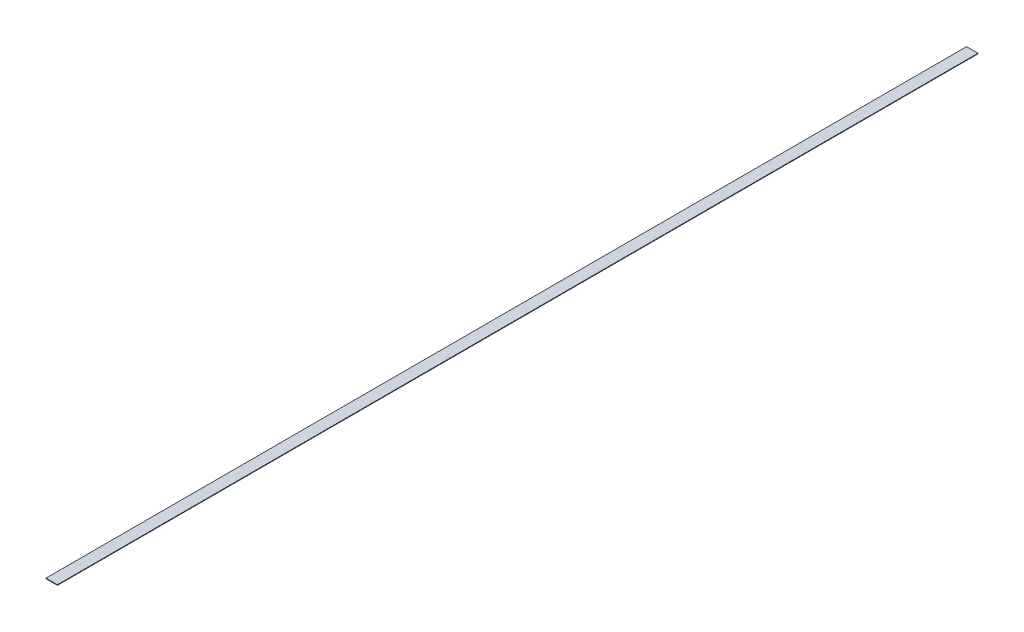
ISO-10303-21;
HEADER;
FILE_DESCRIPTION(('STEP AP214'),'2;1');
FILE_NAME('part.step','',(''),(''),'','','');
FILE_SCHEMA(('AUTOMOTIVE_DESIGN { 1 0 10303 214 1 1 1 1 }'));
ENDSEC;
DATA;
#1=APPLICATION_CONTEXT('core data for automotive mechanical design processes');
#2=APPLICATION_PROTOCOL_DEFINITION('international standard','automotive_design',2000,#1);
#3=PRODUCT_CONTEXT('',#1,'mechanical');
#4=PRODUCT('Part','Part','',(#3));
#5=PRODUCT_RELATED_PRODUCT_CATEGORY('part','',(#4));
#6=PRODUCT_DEFINITION_FORMATION('','',#4);
#7=PRODUCT_DEFINITION_CONTEXT('part definition',#1,'design');
#8=PRODUCT_DEFINITION('design','',#6,#7);
#9=PRODUCT_DEFINITION_SHAPE('','',#8);
#10=(LENGTH_UNIT() NAMED_UNIT(*) SI_UNIT(.MILLI.,.METRE.));
#11=(NAMED_UNIT(*) PLANE_ANGLE_UNIT() SI_UNIT($,.RADIAN.));
#12=(NAMED_UNIT(*) SI_UNIT($,.STERADIAN.) SOLID_ANGLE_UNIT());
#13=UNCERTAINTY_MEASURE_WITH_UNIT(LENGTH_MEASURE(1.E-05),#10,'distance_accuracy_value','');
#14=(GEOMETRIC_REPRESENTATION_CONTEXT(3) GLOBAL_UNCERTAINTY_ASSIGNED_CONTEXT((#13)) GLOBAL_UNIT_ASSIGNED_CONTEXT((#10,
#11,#12)) REPRESENTATION_CONTEXT('',''));
#15=CARTESIAN_POINT('',(0.,0.,0.));
#16=DIRECTION('',(0.,0.,1.));
#17=DIRECTION('',(1.,0.,0.));
#18=AXIS2_PLACEMENT_3D('',#15,#16,#17);
#19=CARTESIAN_POINT('',(-8.75059116986781,1.,-807.162831452454));
#20=DIRECTION('',(0.,0.,1.));
#21=DIRECTION('',(1.,0.,0.));
#22=AXIS2_PLACEMENT_3D('',#19,#20,#21);
#23=PLANE('',#22);
#24=DIRECTION('',(-1.,0.,0.));
#25=VECTOR('',#24,1.);
#26=CARTESIAN_POINT('',(-8.75059116986781,0.,-807.162831452454));
#27=LINE('',#26,#25);
#28=CARTESIAN_POINT('',(11.2494088301322,0.,-807.162831452454));
#29=VERTEX_POINT('',#28);
#30=CARTESIAN_POINT('',(-8.75059116986781,0.,-807.162831452454));
#31=VERTEX_POINT('',#30);
#32=EDGE_CURVE('E97',#29,#31,#27,.T.);
#33=ORIENTED_EDGE('',*,*,#32,.T.);
#34=DIRECTION('',(0.,-1.,0.));
#35=VECTOR('',#34,1.);
#36=CARTESIAN_POINT('',(-8.75059116986781,1.,-807.162831452454));
#37=LINE('',#36,#35);
#38=CARTESIAN_POINT('',(-8.75059116986781,1.,-807.162831452454));
#39=VERTEX_POINT('',#38);
#40=EDGE_CURVE('E11',#39,#31,#37,.T.);
#41=ORIENTED_EDGE('',*,*,#40,.F.);
#42=DIRECTION('',(-1.,0.,0.));
#43=VECTOR('',#42,1.);
#44=CARTESIAN_POINT('',(-8.75059116986781,1.,-807.162831452454));
#45=LINE('',#44,#43);
#46=CARTESIAN_POINT('',(11.2494088301322,1.,-807.162831452454));
#47=VERTEX_POINT('',#46);
#48=EDGE_CURVE('E85',#47,#39,#45,.T.);
#49=ORIENTED_EDGE('',*,*,#48,.F.);
#50=DIRECTION('',(0.,-1.,0.));
#51=VECTOR('',#50,1.);
#52=CARTESIAN_POINT('',(11.2494088301322,1.,-807.162831452454));
#53=LINE('',#52,#51);
#54=EDGE_CURVE('E93',#47,#29,#53,.T.);
#55=ORIENTED_EDGE('',*,*,#54,.T.);
#56=EDGE_LOOP('',(#33,#41,#49,#55));
#57=FACE_BOUND('',#56,.T.);
#58=ADVANCED_FACE('F34',(#57),#23,.F.);
#59=CARTESIAN_POINT('',(-8.75059116986781,1.,-807.162831452454));
#60=DIRECTION('',(1.,0.,0.));
#61=DIRECTION('',(0.,0.,-1.));
#62=AXIS2_PLACEMENT_3D('',#59,#60,#61);
#63=PLANE('',#62);
#64=DIRECTION('',(0.,0.,1.));
#65=VECTOR('',#64,1.);
#66=CARTESIAN_POINT('',(-8.75059116986781,0.,-807.162831452454));
#67=LINE('',#66,#65);
#68=CARTESIAN_POINT('',(-8.75059116986781,0.,805.288718207256));
#69=VERTEX_POINT('',#68);
#70=EDGE_CURVE('E89',#31,#69,#67,.T.);
#71=ORIENTED_EDGE('',*,*,#70,.T.);
#72=DIRECTION('',(0.,-1.,0.));
#73=VECTOR('',#72,1.);
#74=CARTESIAN_POINT('',(-8.75059116986781,1.,805.288718207256));
#75=LINE('',#74,#73);
#76=CARTESIAN_POINT('',(-8.75059116986781,1.,805.288718207256));
#77=VERTEX_POINT('',#76);
#78=EDGE_CURVE('E42',#77,#69,#75,.T.);
#79=ORIENTED_EDGE('',*,*,#78,.F.);
#80=DIRECTION('',(0.,0.,1.));
#81=VECTOR('',#80,1.);
#82=CARTESIAN_POINT('',(-8.75059116986781,1.,-807.162831452454));
#83=LINE('',#82,#81);
#84=EDGE_CURVE('E80',#39,#77,#83,.T.);
#85=ORIENTED_EDGE('',*,*,#84,.F.);
#86=ORIENTED_EDGE('',*,*,#40,.T.);
#87=EDGE_LOOP('',(#71,#79,#85,#86));
#88=FACE_BOUND('',#87,.T.);
#89=ADVANCED_FACE('F88',(#88),#63,.F.);
#90=CARTESIAN_POINT('',(-8.75059116986781,1.,805.288718207256));
#91=DIRECTION('',(0.,0.,-1.));
#92=DIRECTION('',(-1.,0.,0.));
#93=AXIS2_PLACEMENT_3D('',#90,#91,#92);
#94=PLANE('',#93);
#95=DIRECTION('',(1.,0.,0.));
#96=VECTOR('',#95,1.);
#97=CARTESIAN_POINT('',(-8.75059116986781,0.,805.288718207256));
#98=LINE('',#97,#96);
#99=CARTESIAN_POINT('',(11.2494088301322,0.,805.288718207256));
#100=VERTEX_POINT('',#99);
#101=EDGE_CURVE('E67',#69,#100,#98,.T.);
#102=ORIENTED_EDGE('',*,*,#101,.T.);
#103=DIRECTION('',(0.,-1.,0.));
#104=VECTOR('',#103,1.);
#105=CARTESIAN_POINT('',(11.2494088301322,1.,805.288718207256));
#106=LINE('',#105,#104);
#107=CARTESIAN_POINT('',(11.2494088301322,1.,805.288718207256));
#108=VERTEX_POINT('',#107);
#109=EDGE_CURVE('E90',#108,#100,#106,.T.);
#110=ORIENTED_EDGE('',*,*,#109,.F.);
#111=DIRECTION('',(1.,0.,0.));
#112=VECTOR('',#111,1.);
#113=CARTESIAN_POINT('',(-8.75059116986781,1.,805.288718207256));
#114=LINE('',#113,#112);
#115=EDGE_CURVE('E83',#77,#108,#114,.T.);
#116=ORIENTED_EDGE('',*,*,#115,.F.);
#117=ORIENTED_EDGE('',*,*,#78,.T.);
#118=EDGE_LOOP('',(#102,#110,#116,#117));
#119=FACE_BOUND('',#118,.T.);
#120=ADVANCED_FACE('F91',(#119),#94,.F.);
#121=CARTESIAN_POINT('',(11.2494088301322,1.,-807.162831452454));
#122=DIRECTION('',(-1.,0.,0.));
#123=DIRECTION('',(0.,0.,1.));
#124=AXIS2_PLACEMENT_3D('',#121,#122,#123);
#125=PLANE('',#124);
#126=DIRECTION('',(0.,0.,-1.));
#127=VECTOR('',#126,1.);
#128=CARTESIAN_POINT('',(11.2494088301322,0.,-807.162831452454));
#129=LINE('',#128,#127);
#130=EDGE_CURVE('E73',#100,#29,#129,.T.);
#131=ORIENTED_EDGE('',*,*,#130,.T.);
#132=ORIENTED_EDGE('',*,*,#54,.F.);
#133=DIRECTION('',(0.,0.,-1.));
#134=VECTOR('',#133,1.);
#135=CARTESIAN_POINT('',(11.2494088301322,1.,-807.162831452454));
#136=LINE('',#135,#134);
#137=EDGE_CURVE('E50',#108,#47,#136,.T.);
#138=ORIENTED_EDGE('',*,*,#137,.F.);
#139=ORIENTED_EDGE('',*,*,#109,.T.);
#140=EDGE_LOOP('',(#131,#132,#138,#139));
#141=FACE_BOUND('',#140,.T.);
#142=ADVANCED_FACE('F104',(#141),#125,.F.);
#143=CARTESIAN_POINT('',(0.,1.,0.));
#144=DIRECTION('',(0.,-1.,0.));
#145=DIRECTION('',(0.,0.,-1.));
#146=AXIS2_PLACEMENT_3D('',#143,#144,#145);
#147=PLANE('',#146);
#148=ORIENTED_EDGE('',*,*,#48,.T.);
#149=ORIENTED_EDGE('',*,*,#84,.T.);
#150=ORIENTED_EDGE('',*,*,#115,.T.);
#151=ORIENTED_EDGE('',*,*,#137,.T.);
#152=EDGE_LOOP('',(#148,#149,#150,#151));
#153=FACE_BOUND('',#152,.T.);
#154=ADVANCED_FACE('F81',(#153),#147,.F.);
#155=CARTESIAN_POINT('',(0.,0.,0.));
#156=DIRECTION('',(0.,-1.,0.));
#157=DIRECTION('',(0.,0.,-1.));
#158=AXIS2_PLACEMENT_3D('',#155,#156,#157);
#159=PLANE('',#158);
#160=ORIENTED_EDGE('',*,*,#32,.F.);
#161=ORIENTED_EDGE('',*,*,#130,.F.);
#162=ORIENTED_EDGE('',*,*,#101,.F.);
#163=ORIENTED_EDGE('',*,*,#70,.F.);
#164=EDGE_LOOP('',(#160,#161,#162,#163));
#165=FACE_BOUND('',#164,.T.);
#166=ADVANCED_FACE('F107',(#165),#159,.T.);
#167=CLOSED_SHELL('',(#58,#89,#120,#142,#154,#166));
#168=MANIFOLD_SOLID_BREP('B2',#167);
#169=ADVANCED_BREP_SHAPE_REPRESENTATION('',(#18,#168),#14);
#170=SHAPE_DEFINITION_REPRESENTATION(#9,#169);
ENDSEC;
END-ISO-10303-21;
